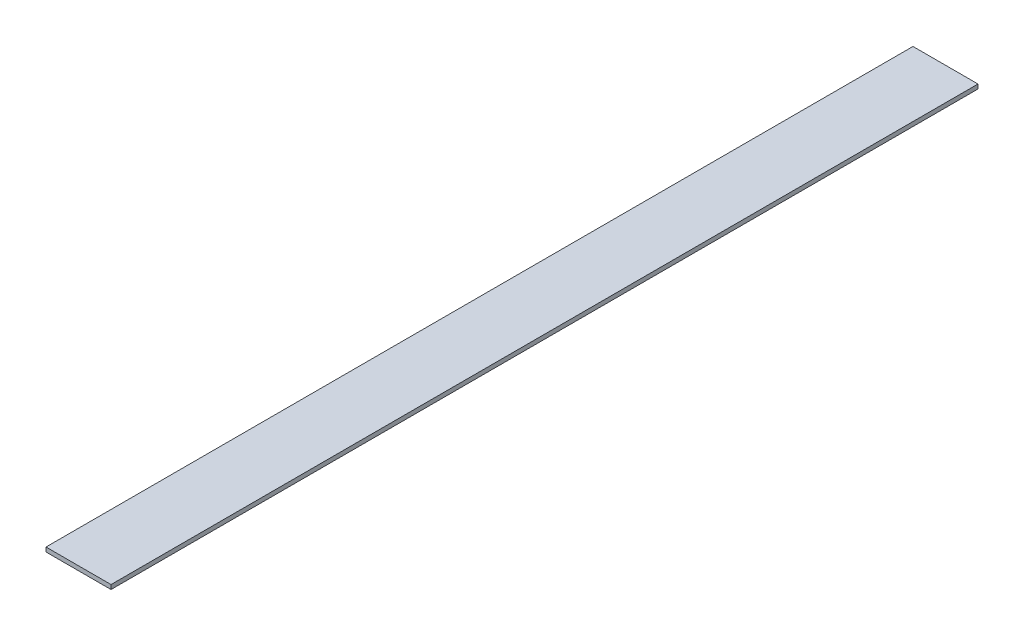
ISO-10303-21;
HEADER;
FILE_DESCRIPTION(('STEP AP214'),'2;1');
FILE_NAME('part.step','',(''),(''),'','','');
FILE_SCHEMA(('AUTOMOTIVE_DESIGN { 1 0 10303 214 1 1 1 1 }'));
ENDSEC;
DATA;
#1=APPLICATION_CONTEXT('core data for automotive mechanical design processes');
#2=APPLICATION_PROTOCOL_DEFINITION('international standard','automotive_design',2000,#1);
#3=PRODUCT_CONTEXT('',#1,'mechanical');
#4=PRODUCT('Part','Part','',(#3));
#5=PRODUCT_RELATED_PRODUCT_CATEGORY('part','',(#4));
#6=PRODUCT_DEFINITION_FORMATION('','',#4);
#7=PRODUCT_DEFINITION_CONTEXT('part definition',#1,'design');
#8=PRODUCT_DEFINITION('design','',#6,#7);
#9=PRODUCT_DEFINITION_SHAPE('','',#8);
#10=(LENGTH_UNIT() NAMED_UNIT(*) SI_UNIT(.MILLI.,.METRE.));
#11=(NAMED_UNIT(*) PLANE_ANGLE_UNIT() SI_UNIT($,.RADIAN.));
#12=(NAMED_UNIT(*) SI_UNIT($,.STERADIAN.) SOLID_ANGLE_UNIT());
#13=UNCERTAINTY_MEASURE_WITH_UNIT(LENGTH_MEASURE(1.E-05),#10,'distance_accuracy_value','');
#14=(GEOMETRIC_REPRESENTATION_CONTEXT(3) GLOBAL_UNCERTAINTY_ASSIGNED_CONTEXT((#13)) GLOBAL_UNIT_ASSIGNED_CONTEXT((#10,
#11,#12)) REPRESENTATION_CONTEXT('',''));
#15=CARTESIAN_POINT('',(0.,0.,0.));
#16=DIRECTION('',(0.,0.,1.));
#17=DIRECTION('',(1.,0.,0.));
#18=AXIS2_PLACEMENT_3D('',#15,#16,#17);
#19=CARTESIAN_POINT('',(0.,1.,0.));
#20=DIRECTION('',(1.,0.,0.));
#21=DIRECTION('',(0.,0.,-1.));
#22=AXIS2_PLACEMENT_3D('',#19,#20,#21);
#23=PLANE('',#22);
#24=DIRECTION('',(0.,0.,1.));
#25=VECTOR('',#24,1.);
#26=CARTESIAN_POINT('',(0.,0.,0.));
#27=LINE('',#26,#25);
#28=CARTESIAN_POINT('',(0.,0.,-200.));
#29=VERTEX_POINT('',#28);
#30=CARTESIAN_POINT('',(0.,0.,0.));
#31=VERTEX_POINT('',#30);
#32=EDGE_CURVE('E96',#29,#31,#27,.T.);
#33=ORIENTED_EDGE('',*,*,#32,.T.);
#34=DIRECTION('',(0.,-1.,0.));
#35=VECTOR('',#34,1.);
#36=CARTESIAN_POINT('',(0.,1.,0.));
#37=LINE('',#36,#35);
#38=CARTESIAN_POINT('',(0.,1.,0.));
#39=VERTEX_POINT('',#38);
#40=EDGE_CURVE('E11',#39,#31,#37,.T.);
#41=ORIENTED_EDGE('',*,*,#40,.F.);
#42=DIRECTION('',(0.,0.,1.));
#43=VECTOR('',#42,1.);
#44=CARTESIAN_POINT('',(0.,1.,0.));
#45=LINE('',#44,#43);
#46=CARTESIAN_POINT('',(0.,1.,-200.));
#47=VERTEX_POINT('',#46);
#48=EDGE_CURVE('E84',#47,#39,#45,.T.);
#49=ORIENTED_EDGE('',*,*,#48,.F.);
#50=DIRECTION('',(0.,-1.,0.));
#51=VECTOR('',#50,1.);
#52=CARTESIAN_POINT('',(0.,1.,-200.));
#53=LINE('',#52,#51);
#54=EDGE_CURVE('E92',#47,#29,#53,.T.);
#55=ORIENTED_EDGE('',*,*,#54,.T.);
#56=EDGE_LOOP('',(#33,#41,#49,#55));
#57=FACE_BOUND('',#56,.T.);
#58=ADVANCED_FACE('F33',(#57),#23,.F.);
#59=CARTESIAN_POINT('',(0.,1.,0.));
#60=DIRECTION('',(0.,0.,-1.));
#61=DIRECTION('',(-1.,0.,0.));
#62=AXIS2_PLACEMENT_3D('',#59,#60,#61);
#63=PLANE('',#62);
#64=DIRECTION('',(1.,0.,0.));
#65=VECTOR('',#64,1.);
#66=CARTESIAN_POINT('',(0.,0.,0.));
#67=LINE('',#66,#65);
#68=CARTESIAN_POINT('',(15.,0.,0.));
#69=VERTEX_POINT('',#68);
#70=EDGE_CURVE('E88',#31,#69,#67,.T.);
#71=ORIENTED_EDGE('',*,*,#70,.T.);
#72=DIRECTION('',(0.,-1.,0.));
#73=VECTOR('',#72,1.);
#74=CARTESIAN_POINT('',(15.,1.,0.));
#75=LINE('',#74,#73);
#76=CARTESIAN_POINT('',(15.,1.,0.));
#77=VERTEX_POINT('',#76);
#78=EDGE_CURVE('E41',#77,#69,#75,.T.);
#79=ORIENTED_EDGE('',*,*,#78,.F.);
#80=DIRECTION('',(1.,0.,0.));
#81=VECTOR('',#80,1.);
#82=CARTESIAN_POINT('',(0.,1.,0.));
#83=LINE('',#82,#81);
#84=EDGE_CURVE('E79',#39,#77,#83,.T.);
#85=ORIENTED_EDGE('',*,*,#84,.F.);
#86=ORIENTED_EDGE('',*,*,#40,.T.);
#87=EDGE_LOOP('',(#71,#79,#85,#86));
#88=FACE_BOUND('',#87,.T.);
#89=ADVANCED_FACE('F87',(#88),#63,.F.);
#90=CARTESIAN_POINT('',(15.,1.,0.));
#91=DIRECTION('',(-1.,0.,0.));
#92=DIRECTION('',(0.,0.,1.));
#93=AXIS2_PLACEMENT_3D('',#90,#91,#92);
#94=PLANE('',#93);
#95=DIRECTION('',(0.,0.,-1.));
#96=VECTOR('',#95,1.);
#97=CARTESIAN_POINT('',(15.,0.,0.));
#98=LINE('',#97,#96);
#99=CARTESIAN_POINT('',(15.,0.,-200.));
#100=VERTEX_POINT('',#99);
#101=EDGE_CURVE('E66',#69,#100,#98,.T.);
#102=ORIENTED_EDGE('',*,*,#101,.T.);
#103=DIRECTION('',(0.,-1.,0.));
#104=VECTOR('',#103,1.);
#105=CARTESIAN_POINT('',(15.,1.,-200.));
#106=LINE('',#105,#104);
#107=CARTESIAN_POINT('',(15.,1.,-200.));
#108=VERTEX_POINT('',#107);
#109=EDGE_CURVE('E89',#108,#100,#106,.T.);
#110=ORIENTED_EDGE('',*,*,#109,.F.);
#111=DIRECTION('',(0.,0.,-1.));
#112=VECTOR('',#111,1.);
#113=CARTESIAN_POINT('',(15.,1.,0.));
#114=LINE('',#113,#112);
#115=EDGE_CURVE('E82',#77,#108,#114,.T.);
#116=ORIENTED_EDGE('',*,*,#115,.F.);
#117=ORIENTED_EDGE('',*,*,#78,.T.);
#118=EDGE_LOOP('',(#102,#110,#116,#117));
#119=FACE_BOUND('',#118,.T.);
#120=ADVANCED_FACE('F90',(#119),#94,.F.);
#121=CARTESIAN_POINT('',(0.,1.,-200.));
#122=DIRECTION('',(0.,0.,1.));
#123=DIRECTION('',(1.,0.,0.));
#124=AXIS2_PLACEMENT_3D('',#121,#122,#123);
#125=PLANE('',#124);
#126=DIRECTION('',(-1.,0.,0.));
#127=VECTOR('',#126,1.);
#128=CARTESIAN_POINT('',(0.,0.,-200.));
#129=LINE('',#128,#127);
#130=EDGE_CURVE('E72',#100,#29,#129,.T.);
#131=ORIENTED_EDGE('',*,*,#130,.T.);
#132=ORIENTED_EDGE('',*,*,#54,.F.);
#133=DIRECTION('',(-1.,0.,0.));
#134=VECTOR('',#133,1.);
#135=CARTESIAN_POINT('',(0.,1.,-200.));
#136=LINE('',#135,#134);
#137=EDGE_CURVE('E49',#108,#47,#136,.T.);
#138=ORIENTED_EDGE('',*,*,#137,.F.);
#139=ORIENTED_EDGE('',*,*,#109,.T.);
#140=EDGE_LOOP('',(#131,#132,#138,#139));
#141=FACE_BOUND('',#140,.T.);
#142=ADVANCED_FACE('F103',(#141),#125,.F.);
#143=CARTESIAN_POINT('',(0.,1.,0.));
#144=DIRECTION('',(0.,-1.,0.));
#145=DIRECTION('',(0.,0.,-1.));
#146=AXIS2_PLACEMENT_3D('',#143,#144,#145);
#147=PLANE('',#146);
#148=ORIENTED_EDGE('',*,*,#48,.T.);
#149=ORIENTED_EDGE('',*,*,#84,.T.);
#150=ORIENTED_EDGE('',*,*,#115,.T.);
#151=ORIENTED_EDGE('',*,*,#137,.T.);
#152=EDGE_LOOP('',(#148,#149,#150,#151));
#153=FACE_BOUND('',#152,.T.);
#154=ADVANCED_FACE('F80',(#153),#147,.F.);
#155=CARTESIAN_POINT('',(0.,0.,0.));
#156=DIRECTION('',(0.,-1.,0.));
#157=DIRECTION('',(0.,0.,-1.));
#158=AXIS2_PLACEMENT_3D('',#155,#156,#157);
#159=PLANE('',#158);
#160=ORIENTED_EDGE('',*,*,#32,.F.);
#161=ORIENTED_EDGE('',*,*,#130,.F.);
#162=ORIENTED_EDGE('',*,*,#101,.F.);
#163=ORIENTED_EDGE('',*,*,#70,.F.);
#164=EDGE_LOOP('',(#160,#161,#162,#163));
#165=FACE_BOUND('',#164,.T.);
#166=ADVANCED_FACE('F106',(#165),#159,.T.);
#167=CLOSED_SHELL('',(#58,#89,#120,#142,#154,#166));
#168=MANIFOLD_SOLID_BREP('B2',#167);
#169=ADVANCED_BREP_SHAPE_REPRESENTATION('',(#18,#168),#14);
#170=SHAPE_DEFINITION_REPRESENTATION(#9,#169);
ENDSEC;
END-ISO-10303-21;
